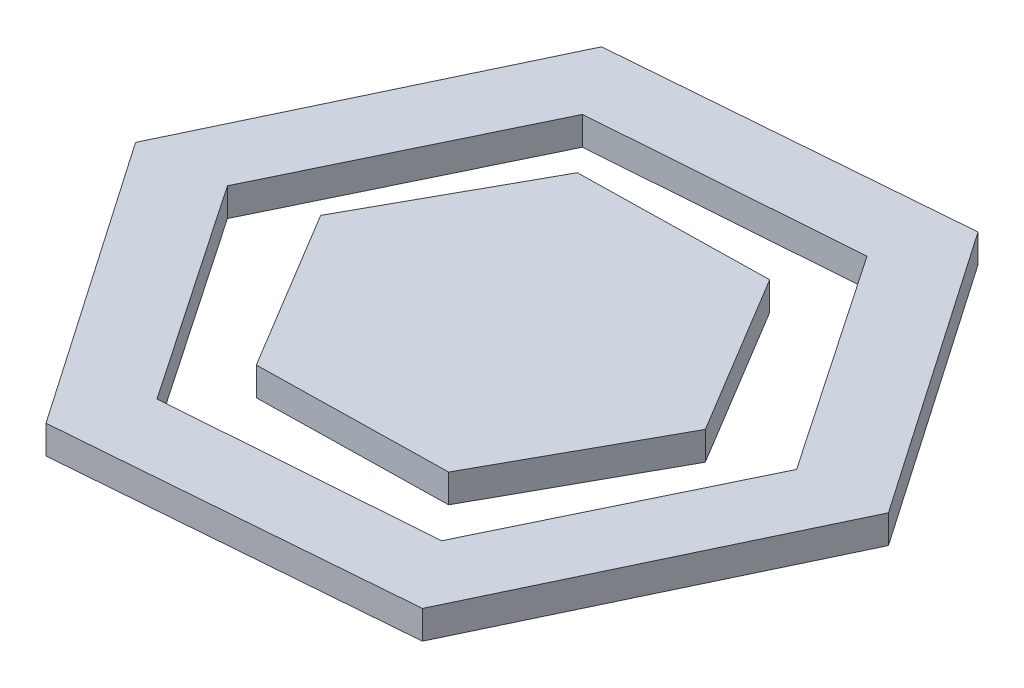
ISO-10303-21;
HEADER;
FILE_DESCRIPTION(('STEP AP214'),'2;1');
FILE_NAME('part.step','',(''),(''),'','','');
FILE_SCHEMA(('AUTOMOTIVE_DESIGN { 1 0 10303 214 1 1 1 1 }'));
ENDSEC;
DATA;
#1=APPLICATION_CONTEXT('core data for automotive mechanical design processes');
#2=APPLICATION_PROTOCOL_DEFINITION('international standard','automotive_design',2000,#1);
#3=PRODUCT_CONTEXT('',#1,'mechanical');
#4=PRODUCT('Part','Part','',(#3));
#5=PRODUCT_RELATED_PRODUCT_CATEGORY('part','',(#4));
#6=PRODUCT_DEFINITION_FORMATION('','',#4);
#7=PRODUCT_DEFINITION_CONTEXT('part definition',#1,'design');
#8=PRODUCT_DEFINITION('design','',#6,#7);
#9=PRODUCT_DEFINITION_SHAPE('','',#8);
#10=(LENGTH_UNIT() NAMED_UNIT(*) SI_UNIT(.MILLI.,.METRE.));
#11=(NAMED_UNIT(*) PLANE_ANGLE_UNIT() SI_UNIT($,.RADIAN.));
#12=(NAMED_UNIT(*) SI_UNIT($,.STERADIAN.) SOLID_ANGLE_UNIT());
#13=UNCERTAINTY_MEASURE_WITH_UNIT(LENGTH_MEASURE(1.E-05),#10,'distance_accuracy_value','');
#14=(GEOMETRIC_REPRESENTATION_CONTEXT(3) GLOBAL_UNCERTAINTY_ASSIGNED_CONTEXT((#13)) GLOBAL_UNIT_ASSIGNED_CONTEXT((#10,
#11,#12)) REPRESENTATION_CONTEXT('',''));
#15=CARTESIAN_POINT('',(0.,0.,0.));
#16=DIRECTION('',(0.,0.,1.));
#17=DIRECTION('',(1.,0.,0.));
#18=AXIS2_PLACEMENT_3D('',#15,#16,#17);
#19=CARTESIAN_POINT('',(-22.7227734733029,0.3,-21.5896592743475));
#20=DIRECTION('',(-0.018496490683271,0.,-0.999828925282922));
#21=DIRECTION('',(-0.999828925282923,0.,0.018496490683271));
#22=AXIS2_PLACEMENT_3D('',#19,#20,#21);
#23=PLANE('',#22);
#24=DIRECTION('',(0.999828925282922,0.,-0.018496490683271));
#25=VECTOR('',#24,1.);
#26=CARTESIAN_POINT('',(-22.7227734733029,0.,-21.5896592743475));
#27=LINE('',#26,#25);
#28=CARTESIAN_POINT('',(-22.7227734733029,0.,-21.5896592743475));
#29=VERTEX_POINT('',#28);
#30=CARTESIAN_POINT('',(-20.7281056601451,0.,-21.626559941741));
#31=VERTEX_POINT('',#30);
#32=EDGE_CURVE('E127',#29,#31,#27,.T.);
#33=ORIENTED_EDGE('',*,*,#32,.T.);
#34=DIRECTION('',(0.,-1.,0.));
#35=VECTOR('',#34,1.);
#36=CARTESIAN_POINT('',(-20.7281056601451,0.3,-21.626559941741));
#37=LINE('',#36,#35);
#38=CARTESIAN_POINT('',(-20.7281056601451,0.3,-21.626559941741));
#39=VERTEX_POINT('',#38);
#40=EDGE_CURVE('E12',#39,#31,#37,.T.);
#41=ORIENTED_EDGE('',*,*,#40,.F.);
#42=DIRECTION('',(0.999828925282922,0.,-0.018496490683271));
#43=VECTOR('',#42,1.);
#44=CARTESIAN_POINT('',(-22.7227734733029,0.3,-21.5896592743475));
#45=LINE('',#44,#43);
#46=CARTESIAN_POINT('',(-22.7227734733029,0.3,-21.5896592743475));
#47=VERTEX_POINT('',#46);
#48=EDGE_CURVE('E137',#47,#39,#45,.T.);
#49=ORIENTED_EDGE('',*,*,#48,.F.);
#50=DIRECTION('',(0.,-1.,0.));
#51=VECTOR('',#50,1.);
#52=CARTESIAN_POINT('',(-22.7227734733029,0.3,-21.5896592743475));
#53=LINE('',#52,#51);
#54=EDGE_CURVE('E123',#47,#29,#53,.T.);
#55=ORIENTED_EDGE('',*,*,#54,.T.);
#56=EDGE_LOOP('',(#33,#41,#49,#55));
#57=FACE_BOUND('',#56,.T.);
#58=ADVANCED_FACE('F43',(#57),#23,.F.);
#59=CARTESIAN_POINT('',(-20.7281056601451,0.3,-21.626559941741));
#60=DIRECTION('',(-0.87512549407514,0.,-0.483896031828886));
#61=DIRECTION('',(-0.483896031828886,0.,0.87512549407514));
#62=AXIS2_PLACEMENT_3D('',#59,#60,#61);
#63=PLANE('',#62);
#64=DIRECTION('',(0.483896031828886,0.,-0.87512549407514));
#65=VECTOR('',#64,1.);
#66=CARTESIAN_POINT('',(-20.7281056601451,0.,-21.626559941741));
#67=LINE('',#66,#65);
#68=CARTESIAN_POINT('',(-19.7627286689455,0.,-23.3724432737436));
#69=VERTEX_POINT('',#68);
#70=EDGE_CURVE('E130',#31,#69,#67,.T.);
#71=ORIENTED_EDGE('',*,*,#70,.T.);
#72=DIRECTION('',(0.,-1.,0.));
#73=VECTOR('',#72,1.);
#74=CARTESIAN_POINT('',(-19.7627286689455,0.3,-23.3724432737436));
#75=LINE('',#74,#73);
#76=CARTESIAN_POINT('',(-19.7627286689455,0.3,-23.3724432737436));
#77=VERTEX_POINT('',#76);
#78=EDGE_CURVE('E51',#77,#69,#75,.T.);
#79=ORIENTED_EDGE('',*,*,#78,.F.);
#80=DIRECTION('',(0.483896031828886,0.,-0.87512549407514));
#81=VECTOR('',#80,1.);
#82=CARTESIAN_POINT('',(-20.7281056601451,0.3,-21.626559941741));
#83=LINE('',#82,#81);
#84=EDGE_CURVE('E96',#39,#77,#83,.T.);
#85=ORIENTED_EDGE('',*,*,#84,.F.);
#86=ORIENTED_EDGE('',*,*,#40,.T.);
#87=EDGE_LOOP('',(#71,#79,#85,#86));
#88=FACE_BOUND('',#87,.T.);
#89=ADVANCED_FACE('F161',(#88),#63,.F.);
#90=CARTESIAN_POINT('',(-19.7627286689455,0.3,-23.3724432737436));
#91=DIRECTION('',(-0.856629003391868,0.,0.515932893454037));
#92=DIRECTION('',(0.515932893454037,0.,0.856629003391868));
#93=AXIS2_PLACEMENT_3D('',#90,#91,#92);
#94=PLANE('',#93);
#95=DIRECTION('',(-0.515932893454037,0.,-0.856629003391868));
#96=VECTOR('',#95,1.);
#97=CARTESIAN_POINT('',(-19.7627286689455,0.,-23.3724432737436));
#98=LINE('',#97,#96);
#99=CARTESIAN_POINT('',(-20.7920194909039,0.,-25.0814259383527));
#100=VERTEX_POINT('',#99);
#101=EDGE_CURVE('E132',#69,#100,#98,.T.);
#102=ORIENTED_EDGE('',*,*,#101,.T.);
#103=DIRECTION('',(0.,-1.,0.));
#104=VECTOR('',#103,1.);
#105=CARTESIAN_POINT('',(-20.7920194909039,0.3,-25.0814259383527));
#106=LINE('',#105,#104);
#107=CARTESIAN_POINT('',(-20.7920194909039,0.3,-25.0814259383527));
#108=VERTEX_POINT('',#107);
#109=EDGE_CURVE('E118',#108,#100,#106,.T.);
#110=ORIENTED_EDGE('',*,*,#109,.F.);
#111=DIRECTION('',(-0.515932893454037,0.,-0.856629003391868));
#112=VECTOR('',#111,1.);
#113=CARTESIAN_POINT('',(-19.7627286689455,0.3,-23.3724432737436));
#114=LINE('',#113,#112);
#115=EDGE_CURVE('E109',#77,#108,#114,.T.);
#116=ORIENTED_EDGE('',*,*,#115,.F.);
#117=ORIENTED_EDGE('',*,*,#78,.T.);
#118=EDGE_LOOP('',(#102,#110,#116,#117));
#119=FACE_BOUND('',#118,.T.);
#120=ADVANCED_FACE('F143',(#119),#94,.F.);
#121=CARTESIAN_POINT('',(-20.7920194909039,0.3,-25.0814259383527));
#122=DIRECTION('',(0.018496490683271,0.,0.999828925282922));
#123=DIRECTION('',(0.999828925282923,0.,-0.018496490683271));
#124=AXIS2_PLACEMENT_3D('',#121,#122,#123);
#125=PLANE('',#124);
#126=DIRECTION('',(-0.999828925282922,0.,0.018496490683271));
#127=VECTOR('',#126,1.);
#128=CARTESIAN_POINT('',(-20.7920194909039,0.,-25.0814259383527));
#129=LINE('',#128,#127);
#130=CARTESIAN_POINT('',(-22.7866873040617,0.,-25.0445252709592));
#131=VERTEX_POINT('',#130);
#132=EDGE_CURVE('E117',#100,#131,#129,.T.);
#133=ORIENTED_EDGE('',*,*,#132,.T.);
#134=DIRECTION('',(0.,-1.,0.));
#135=VECTOR('',#134,1.);
#136=CARTESIAN_POINT('',(-22.7866873040617,0.3,-25.0445252709592));
#137=LINE('',#136,#135);
#138=CARTESIAN_POINT('',(-22.7866873040617,0.3,-25.0445252709592));
#139=VERTEX_POINT('',#138);
#140=EDGE_CURVE('E114',#139,#131,#137,.T.);
#141=ORIENTED_EDGE('',*,*,#140,.F.);
#142=DIRECTION('',(-0.999828925282922,0.,0.018496490683271));
#143=VECTOR('',#142,1.);
#144=CARTESIAN_POINT('',(-20.7920194909039,0.3,-25.0814259383527));
#145=LINE('',#144,#143);
#146=EDGE_CURVE('E103',#108,#139,#145,.T.);
#147=ORIENTED_EDGE('',*,*,#146,.F.);
#148=ORIENTED_EDGE('',*,*,#109,.T.);
#149=EDGE_LOOP('',(#133,#141,#147,#148));
#150=FACE_BOUND('',#149,.T.);
#151=ADVANCED_FACE('F115',(#150),#125,.F.);
#152=CARTESIAN_POINT('',(-22.7866873040617,0.3,-25.0445252709592));
#153=DIRECTION('',(0.87512549407514,0.,0.483896031828885));
#154=DIRECTION('',(0.483896031828885,0.,-0.87512549407514));
#155=AXIS2_PLACEMENT_3D('',#152,#153,#154);
#156=PLANE('',#155);
#157=DIRECTION('',(-0.483896031828885,0.,0.875125494075141));
#158=VECTOR('',#157,1.);
#159=CARTESIAN_POINT('',(-22.7866873040617,0.,-25.0445252709592));
#160=LINE('',#159,#158);
#161=CARTESIAN_POINT('',(-23.7520642952612,0.,-23.2986419389566));
#162=VERTEX_POINT('',#161);
#163=EDGE_CURVE('E82',#131,#162,#160,.T.);
#164=ORIENTED_EDGE('',*,*,#163,.T.);
#165=DIRECTION('',(0.,-1.,0.));
#166=VECTOR('',#165,1.);
#167=CARTESIAN_POINT('',(-23.7520642952612,0.3,-23.2986419389566));
#168=LINE('',#167,#166);
#169=CARTESIAN_POINT('',(-23.7520642952612,0.3,-23.2986419389566));
#170=VERTEX_POINT('',#169);
#171=EDGE_CURVE('E119',#170,#162,#168,.T.);
#172=ORIENTED_EDGE('',*,*,#171,.F.);
#173=DIRECTION('',(-0.483896031828885,0.,0.875125494075141));
#174=VECTOR('',#173,1.);
#175=CARTESIAN_POINT('',(-22.7866873040617,0.3,-25.0445252709592));
#176=LINE('',#175,#174);
#177=EDGE_CURVE('E107',#139,#170,#176,.T.);
#178=ORIENTED_EDGE('',*,*,#177,.F.);
#179=ORIENTED_EDGE('',*,*,#140,.T.);
#180=EDGE_LOOP('',(#164,#172,#178,#179));
#181=FACE_BOUND('',#180,.T.);
#182=ADVANCED_FACE('F121',(#181),#156,.F.);
#183=CARTESIAN_POINT('',(-23.7520642952612,0.3,-23.2986419389566));
#184=DIRECTION('',(0.856629003391869,0.,-0.515932893454036));
#185=DIRECTION('',(-0.515932893454036,0.,-0.856629003391869));
#186=AXIS2_PLACEMENT_3D('',#183,#184,#185);
#187=PLANE('',#186);
#188=DIRECTION('',(0.515932893454036,0.,0.856629003391869));
#189=VECTOR('',#188,1.);
#190=CARTESIAN_POINT('',(-23.7520642952612,0.,-23.2986419389566));
#191=LINE('',#190,#189);
#192=EDGE_CURVE('E88',#162,#29,#191,.T.);
#193=ORIENTED_EDGE('',*,*,#192,.T.);
#194=ORIENTED_EDGE('',*,*,#54,.F.);
#195=DIRECTION('',(0.515932893454036,0.,0.856629003391869));
#196=VECTOR('',#195,1.);
#197=CARTESIAN_POINT('',(-23.7520642952612,0.3,-23.2986419389566));
#198=LINE('',#197,#196);
#199=EDGE_CURVE('E59',#170,#47,#198,.T.);
#200=ORIENTED_EDGE('',*,*,#199,.F.);
#201=ORIENTED_EDGE('',*,*,#171,.T.);
#202=EDGE_LOOP('',(#193,#194,#200,#201));
#203=FACE_BOUND('',#202,.T.);
#204=ADVANCED_FACE('F150',(#203),#187,.F.);
#205=CARTESIAN_POINT('',(0.,0.3,0.));
#206=DIRECTION('',(0.,1.,0.));
#207=DIRECTION('',(0.,0.,1.));
#208=AXIS2_PLACEMENT_3D('',#205,#206,#207);
#209=PLANE('',#208);
#210=ORIENTED_EDGE('',*,*,#48,.T.);
#211=ORIENTED_EDGE('',*,*,#84,.T.);
#212=ORIENTED_EDGE('',*,*,#115,.T.);
#213=ORIENTED_EDGE('',*,*,#146,.T.);
#214=ORIENTED_EDGE('',*,*,#177,.T.);
#215=ORIENTED_EDGE('',*,*,#199,.T.);
#216=EDGE_LOOP('',(#210,#211,#212,#213,#214,#215));
#217=FACE_BOUND('',#216,.T.);
#218=ADVANCED_FACE('F105',(#217),#209,.T.);
#219=CARTESIAN_POINT('',(0.,0.,0.));
#220=DIRECTION('',(0.,1.,0.));
#221=DIRECTION('',(0.,0.,1.));
#222=AXIS2_PLACEMENT_3D('',#219,#220,#221);
#223=PLANE('',#222);
#224=ORIENTED_EDGE('',*,*,#32,.F.);
#225=ORIENTED_EDGE('',*,*,#192,.F.);
#226=ORIENTED_EDGE('',*,*,#163,.F.);
#227=ORIENTED_EDGE('',*,*,#132,.F.);
#228=ORIENTED_EDGE('',*,*,#101,.F.);
#229=ORIENTED_EDGE('',*,*,#70,.F.);
#230=EDGE_LOOP('',(#224,#225,#226,#227,#228,#229));
#231=FACE_BOUND('',#230,.T.);
#232=ADVANCED_FACE('F146',(#231),#223,.F.);
#233=CLOSED_SHELL('',(#58,#89,#120,#151,#182,#204,#218,#232));
#234=MANIFOLD_SOLID_BREP('B2',#233);
#235=CARTESIAN_POINT('',(0.,0.3,0.));
#236=DIRECTION('',(0.,1.,0.));
#237=DIRECTION('',(0.,0.,1.));
#238=AXIS2_PLACEMENT_3D('',#235,#236,#237);
#239=PLANE('',#238);
#240=DIRECTION('',(0.996823738084933,0.,-0.0796394072704047));
#241=VECTOR('',#240,1.);
#242=CARTESIAN_POINT('',(-23.3011035479228,0.3,-19.9465054507831));
#243=LINE('',#242,#241);
#244=CARTESIAN_POINT('',(-23.3011035479228,0.3,-19.9465054507831));
#245=VERTEX_POINT('',#244);
#246=CARTESIAN_POINT('',(-19.6189570412195,0.3,-20.2406838035579));
#247=VERTEX_POINT('',#246);
#248=EDGE_CURVE('E359',#245,#247,#243,.T.);
#249=ORIENTED_EDGE('',*,*,#248,.T.);
#250=DIRECTION('',(0.429442119203962,0.,-0.903094383912119));
#251=VECTOR('',#250,1.);
#252=CARTESIAN_POINT('',(-19.6189570412195,0.3,-20.2406838035579));
#253=LINE('',#252,#251);
#254=CARTESIAN_POINT('',(-18.0326497146143,0.3,-23.5766053952065));
#255=VERTEX_POINT('',#254);
#256=EDGE_CURVE('E362',#247,#255,#253,.T.);
#257=ORIENTED_EDGE('',*,*,#256,.T.);
#258=DIRECTION('',(-0.567381618880972,0.,-0.823454976641715));
#259=VECTOR('',#258,1.);
#260=CARTESIAN_POINT('',(-18.0326497146143,0.3,-23.5766053952065));
#261=LINE('',#260,#259);
#262=CARTESIAN_POINT('',(-20.1284888947124,0.3,-26.6183486340802));
#263=VERTEX_POINT('',#262);
#264=EDGE_CURVE('E365',#255,#263,#261,.T.);
#265=ORIENTED_EDGE('',*,*,#264,.T.);
#266=DIRECTION('',(-0.996823738084933,0.,0.0796394072704037));
#267=VECTOR('',#266,1.);
#268=CARTESIAN_POINT('',(-20.1284888947124,0.3,-26.6183486340802));
#269=LINE('',#268,#267);
#270=CARTESIAN_POINT('',(-23.8106354014156,0.3,-26.3241702813054));
#271=VERTEX_POINT('',#270);
#272=EDGE_CURVE('E367',#263,#271,#269,.T.);
#273=ORIENTED_EDGE('',*,*,#272,.T.);
#274=DIRECTION('',(-0.429442119203962,0.,0.903094383912119));
#275=VECTOR('',#274,1.);
#276=CARTESIAN_POINT('',(-23.8106354014156,0.3,-26.3241702813054));
#277=LINE('',#276,#275);
#278=CARTESIAN_POINT('',(-25.3969427280208,0.3,-22.9882486896569));
#279=VERTEX_POINT('',#278);
#280=EDGE_CURVE('E369',#271,#279,#277,.T.);
#281=ORIENTED_EDGE('',*,*,#280,.T.);
#282=DIRECTION('',(0.567381618880971,0.,0.823454976641715));
#283=VECTOR('',#282,1.);
#284=CARTESIAN_POINT('',(-25.3969427280208,0.3,-22.9882486896569));
#285=LINE('',#284,#283);
#286=EDGE_CURVE('E371',#279,#245,#285,.T.);
#287=ORIENTED_EDGE('',*,*,#286,.T.);
#288=EDGE_LOOP('',(#249,#257,#265,#273,#281,#287));
#289=FACE_BOUND('',#288,.T.);
#290=DIRECTION('',(0.435156540688244,0.,-0.900354810669794));
#291=VECTOR('',#290,1.);
#292=CARTESIAN_POINT('',(-20.1364291043533,0.3,-20.9603440210333));
#293=LINE('',#292,#291);
#294=CARTESIAN_POINT('',(-20.1364291043533,0.3,-20.9603440210333));
#295=VERTEX_POINT('',#294);
#296=CARTESIAN_POINT('',(-18.9146297766079,0.3,-23.4882915515216));
#297=VERTEX_POINT('',#296);
#298=EDGE_CURVE('E316',#295,#297,#293,.T.);
#299=ORIENTED_EDGE('',*,*,#298,.F.);
#300=DIRECTION('',(0.997308408803692,0.,-0.07332078647592));
#301=VECTOR('',#300,1.);
#302=CARTESIAN_POINT('',(-22.9365955490629,0.3,-20.7544795119434));
#303=LINE('',#302,#301);
#304=CARTESIAN_POINT('',(-22.9365955490629,0.3,-20.7544795119434));
#305=VERTEX_POINT('',#304);
#306=EDGE_CURVE('E308',#305,#295,#303,.T.);
#307=ORIENTED_EDGE('',*,*,#306,.F.);
#308=DIRECTION('',(0.562151868115448,0.,0.827034024193873));
#309=VECTOR('',#308,1.);
#310=CARTESIAN_POINT('',(-24.5149626660272,0.3,-23.0765625333418));
#311=LINE('',#310,#309);
#312=CARTESIAN_POINT('',(-24.5149626660272,0.3,-23.0765625333418));
#313=VERTEX_POINT('',#312);
#314=EDGE_CURVE('E337',#313,#305,#311,.T.);
#315=ORIENTED_EDGE('',*,*,#314,.F.);
#316=DIRECTION('',(-0.435156540688244,0.,0.900354810669794));
#317=VECTOR('',#316,1.);
#318=CARTESIAN_POINT('',(-23.2931633382818,0.3,-25.6045100638301));
#319=LINE('',#318,#317);
#320=CARTESIAN_POINT('',(-23.2931633382818,0.3,-25.6045100638301));
#321=VERTEX_POINT('',#320);
#322=EDGE_CURVE('E335',#321,#313,#319,.T.);
#323=ORIENTED_EDGE('',*,*,#322,.F.);
#324=DIRECTION('',(-0.997308408803692,0.,0.0733207864759199));
#325=VECTOR('',#324,1.);
#326=CARTESIAN_POINT('',(-20.4929968935722,0.3,-25.8103745729199));
#327=LINE('',#326,#325);
#328=CARTESIAN_POINT('',(-20.4929968935722,0.3,-25.8103745729199));
#329=VERTEX_POINT('',#328);
#330=EDGE_CURVE('E331',#329,#321,#327,.T.);
#331=ORIENTED_EDGE('',*,*,#330,.F.);
#332=DIRECTION('',(-0.562151868115447,0.,-0.827034024193874));
#333=VECTOR('',#332,1.);
#334=CARTESIAN_POINT('',(-18.9146297766079,0.3,-23.4882915515216));
#335=LINE('',#334,#333);
#336=EDGE_CURVE('E329',#297,#329,#335,.T.);
#337=ORIENTED_EDGE('',*,*,#336,.F.);
#338=EDGE_LOOP('',(#299,#307,#315,#323,#331,#337));
#339=FACE_BOUND('',#338,.T.);
#340=ADVANCED_FACE('F219',(#289,#339),#239,.T.);
#341=CARTESIAN_POINT('',(0.,0.,0.));
#342=DIRECTION('',(0.,1.,0.));
#343=DIRECTION('',(0.,0.,1.));
#344=AXIS2_PLACEMENT_3D('',#341,#342,#343);
#345=PLANE('',#344);
#346=DIRECTION('',(0.996823738084933,0.,-0.0796394072704047));
#347=VECTOR('',#346,1.);
#348=CARTESIAN_POINT('',(-23.3011035479228,0.,-19.9465054507831));
#349=LINE('',#348,#347);
#350=CARTESIAN_POINT('',(-23.3011035479228,0.,-19.9465054507831));
#351=VERTEX_POINT('',#350);
#352=CARTESIAN_POINT('',(-19.6189570412195,0.,-20.2406838035579));
#353=VERTEX_POINT('',#352);
#354=EDGE_CURVE('E324',#351,#353,#349,.T.);
#355=ORIENTED_EDGE('',*,*,#354,.F.);
#356=DIRECTION('',(0.567381618880971,0.,0.823454976641715));
#357=VECTOR('',#356,1.);
#358=CARTESIAN_POINT('',(-25.3969427280208,0.,-22.9882486896569));
#359=LINE('',#358,#357);
#360=CARTESIAN_POINT('',(-25.3969427280208,0.,-22.9882486896569));
#361=VERTEX_POINT('',#360);
#362=EDGE_CURVE('E363',#361,#351,#359,.T.);
#363=ORIENTED_EDGE('',*,*,#362,.F.);
#364=DIRECTION('',(-0.429442119203962,0.,0.903094383912119));
#365=VECTOR('',#364,1.);
#366=CARTESIAN_POINT('',(-23.8106354014156,0.,-26.3241702813054));
#367=LINE('',#366,#365);
#368=CARTESIAN_POINT('',(-23.8106354014156,0.,-26.3241702813054));
#369=VERTEX_POINT('',#368);
#370=EDGE_CURVE('E382',#369,#361,#367,.T.);
#371=ORIENTED_EDGE('',*,*,#370,.F.);
#372=DIRECTION('',(-0.996823738084933,0.,0.0796394072704037));
#373=VECTOR('',#372,1.);
#374=CARTESIAN_POINT('',(-20.1284888947124,0.,-26.6183486340802));
#375=LINE('',#374,#373);
#376=CARTESIAN_POINT('',(-20.1284888947124,0.,-26.6183486340802));
#377=VERTEX_POINT('',#376);
#378=EDGE_CURVE('E380',#377,#369,#375,.T.);
#379=ORIENTED_EDGE('',*,*,#378,.F.);
#380=DIRECTION('',(-0.567381618880972,0.,-0.823454976641715));
#381=VECTOR('',#380,1.);
#382=CARTESIAN_POINT('',(-18.0326497146143,0.,-23.5766053952065));
#383=LINE('',#382,#381);
#384=CARTESIAN_POINT('',(-18.0326497146143,0.,-23.5766053952065));
#385=VERTEX_POINT('',#384);
#386=EDGE_CURVE('E378',#385,#377,#383,.T.);
#387=ORIENTED_EDGE('',*,*,#386,.F.);
#388=DIRECTION('',(0.429442119203962,0.,-0.903094383912119));
#389=VECTOR('',#388,1.);
#390=CARTESIAN_POINT('',(-19.6189570412195,0.,-20.2406838035579));
#391=LINE('',#390,#389);
#392=EDGE_CURVE('E376',#353,#385,#391,.T.);
#393=ORIENTED_EDGE('',*,*,#392,.F.);
#394=EDGE_LOOP('',(#355,#363,#371,#379,#387,#393));
#395=FACE_BOUND('',#394,.T.);
#396=DIRECTION('',(0.997308408803692,0.,-0.07332078647592));
#397=VECTOR('',#396,1.);
#398=CARTESIAN_POINT('',(-22.9365955490629,0.,-20.7544795119434));
#399=LINE('',#398,#397);
#400=CARTESIAN_POINT('',(-22.9365955490629,0.,-20.7544795119434));
#401=VERTEX_POINT('',#400);
#402=CARTESIAN_POINT('',(-20.1364291043533,0.,-20.9603440210333));
#403=VERTEX_POINT('',#402);
#404=EDGE_CURVE('E242',#401,#403,#399,.T.);
#405=ORIENTED_EDGE('',*,*,#404,.T.);
#406=DIRECTION('',(0.435156540688244,0.,-0.900354810669794));
#407=VECTOR('',#406,1.);
#408=CARTESIAN_POINT('',(-20.1364291043533,0.,-20.9603440210333));
#409=LINE('',#408,#407);
#410=CARTESIAN_POINT('',(-18.9146297766079,0.,-23.4882915515216));
#411=VERTEX_POINT('',#410);
#412=EDGE_CURVE('E323',#403,#411,#409,.T.);
#413=ORIENTED_EDGE('',*,*,#412,.T.);
#414=DIRECTION('',(-0.562151868115447,0.,-0.827034024193874));
#415=VECTOR('',#414,1.);
#416=CARTESIAN_POINT('',(-18.9146297766079,0.,-23.4882915515216));
#417=LINE('',#416,#415);
#418=CARTESIAN_POINT('',(-20.4929968935722,0.,-25.8103745729199));
#419=VERTEX_POINT('',#418);
#420=EDGE_CURVE('E341',#411,#419,#417,.T.);
#421=ORIENTED_EDGE('',*,*,#420,.T.);
#422=DIRECTION('',(-0.997308408803692,0.,0.0733207864759199));
#423=VECTOR('',#422,1.);
#424=CARTESIAN_POINT('',(-20.4929968935722,0.,-25.8103745729199));
#425=LINE('',#424,#423);
#426=CARTESIAN_POINT('',(-23.2931633382818,0.,-25.6045100638301));
#427=VERTEX_POINT('',#426);
#428=EDGE_CURVE('E344',#419,#427,#425,.T.);
#429=ORIENTED_EDGE('',*,*,#428,.T.);
#430=DIRECTION('',(-0.435156540688244,0.,0.900354810669794));
#431=VECTOR('',#430,1.);
#432=CARTESIAN_POINT('',(-23.2931633382818,0.,-25.6045100638301));
#433=LINE('',#432,#431);
#434=CARTESIAN_POINT('',(-24.5149626660272,0.,-23.0765625333418));
#435=VERTEX_POINT('',#434);
#436=EDGE_CURVE('E347',#427,#435,#433,.T.);
#437=ORIENTED_EDGE('',*,*,#436,.T.);
#438=DIRECTION('',(0.562151868115448,0.,0.827034024193873));
#439=VECTOR('',#438,1.);
#440=CARTESIAN_POINT('',(-24.5149626660272,0.,-23.0765625333418));
#441=LINE('',#440,#439);
#442=EDGE_CURVE('E317',#435,#401,#441,.T.);
#443=ORIENTED_EDGE('',*,*,#442,.T.);
#444=EDGE_LOOP('',(#405,#413,#421,#429,#437,#443));
#445=FACE_BOUND('',#444,.T.);
#446=ADVANCED_FACE('F406',(#395,#445),#345,.F.);
#447=CARTESIAN_POINT('',(-23.3011035479228,0.3,-19.9465054507831));
#448=DIRECTION('',(-0.0796394072704047,0.,-0.996823738084933));
#449=DIRECTION('',(-0.996823738084933,0.,0.0796394072704047));
#450=AXIS2_PLACEMENT_3D('',#447,#448,#449);
#451=PLANE('',#450);
#452=ORIENTED_EDGE('',*,*,#354,.T.);
#453=DIRECTION('',(0.,-1.,0.));
#454=VECTOR('',#453,1.);
#455=CARTESIAN_POINT('',(-19.6189570412195,0.3,-20.2406838035579));
#456=LINE('',#455,#454);
#457=EDGE_CURVE('E41',#247,#353,#456,.T.);
#458=ORIENTED_EDGE('',*,*,#457,.F.);
#459=ORIENTED_EDGE('',*,*,#248,.F.);
#460=DIRECTION('',(0.,-1.,0.));
#461=VECTOR('',#460,1.);
#462=CARTESIAN_POINT('',(-23.3011035479228,0.3,-19.9465054507831));
#463=LINE('',#462,#461);
#464=EDGE_CURVE('E373',#245,#351,#463,.T.);
#465=ORIENTED_EDGE('',*,*,#464,.T.);
#466=EDGE_LOOP('',(#452,#458,#459,#465));
#467=FACE_BOUND('',#466,.T.);
#468=ADVANCED_FACE('F221',(#467),#451,.F.);
#469=CARTESIAN_POINT('',(-19.6189570412195,0.3,-20.2406838035579));
#470=DIRECTION('',(-0.903094383912119,0.,-0.429442119203962));
#471=DIRECTION('',(-0.429442119203962,0.,0.903094383912119));
#472=AXIS2_PLACEMENT_3D('',#469,#470,#471);
#473=PLANE('',#472);
#474=ORIENTED_EDGE('',*,*,#392,.T.);
#475=DIRECTION('',(0.,-1.,0.));
#476=VECTOR('',#475,1.);
#477=CARTESIAN_POINT('',(-18.0326497146143,0.3,-23.5766053952065));
#478=LINE('',#477,#476);
#479=EDGE_CURVE('E227',#255,#385,#478,.T.);
#480=ORIENTED_EDGE('',*,*,#479,.F.);
#481=ORIENTED_EDGE('',*,*,#256,.F.);
#482=ORIENTED_EDGE('',*,*,#457,.T.);
#483=EDGE_LOOP('',(#474,#480,#481,#482));
#484=FACE_BOUND('',#483,.T.);
#485=ADVANCED_FACE('F423',(#484),#473,.F.);
#486=CARTESIAN_POINT('',(-18.0326497146143,0.3,-23.5766053952065));
#487=DIRECTION('',(-0.823454976641715,0.,0.567381618880972));
#488=DIRECTION('',(0.567381618880972,0.,0.823454976641715));
#489=AXIS2_PLACEMENT_3D('',#486,#487,#488);
#490=PLANE('',#489);
#491=ORIENTED_EDGE('',*,*,#386,.T.);
#492=DIRECTION('',(0.,-1.,0.));
#493=VECTOR('',#492,1.);
#494=CARTESIAN_POINT('',(-20.1284888947124,0.3,-26.6183486340802));
#495=LINE('',#494,#493);
#496=EDGE_CURVE('E393',#263,#377,#495,.T.);
#497=ORIENTED_EDGE('',*,*,#496,.F.);
#498=ORIENTED_EDGE('',*,*,#264,.F.);
#499=ORIENTED_EDGE('',*,*,#479,.T.);
#500=EDGE_LOOP('',(#491,#497,#498,#499));
#501=FACE_BOUND('',#500,.T.);
#502=ADVANCED_FACE('F400',(#501),#490,.F.);
#503=CARTESIAN_POINT('',(-20.1284888947124,0.3,-26.6183486340802));
#504=DIRECTION('',(0.0796394072704037,0.,0.996823738084933));
#505=DIRECTION('',(0.996823738084933,0.,-0.0796394072704037));
#506=AXIS2_PLACEMENT_3D('',#503,#504,#505);
#507=PLANE('',#506);
#508=ORIENTED_EDGE('',*,*,#378,.T.);
#509=DIRECTION('',(0.,-1.,0.));
#510=VECTOR('',#509,1.);
#511=CARTESIAN_POINT('',(-23.8106354014156,0.3,-26.3241702813054));
#512=LINE('',#511,#510);
#513=EDGE_CURVE('E390',#271,#369,#512,.T.);
#514=ORIENTED_EDGE('',*,*,#513,.F.);
#515=ORIENTED_EDGE('',*,*,#272,.F.);
#516=ORIENTED_EDGE('',*,*,#496,.T.);
#517=EDGE_LOOP('',(#508,#514,#515,#516));
#518=FACE_BOUND('',#517,.T.);
#519=ADVANCED_FACE('F412',(#518),#507,.F.);
#520=CARTESIAN_POINT('',(-23.8106354014156,0.3,-26.3241702813054));
#521=DIRECTION('',(0.903094383912119,0.,0.429442119203962));
#522=DIRECTION('',(0.429442119203962,0.,-0.903094383912119));
#523=AXIS2_PLACEMENT_3D('',#520,#521,#522);
#524=PLANE('',#523);
#525=ORIENTED_EDGE('',*,*,#370,.T.);
#526=DIRECTION('',(0.,-1.,0.));
#527=VECTOR('',#526,1.);
#528=CARTESIAN_POINT('',(-25.3969427280208,0.3,-22.9882486896569));
#529=LINE('',#528,#527);
#530=EDGE_CURVE('E387',#279,#361,#529,.T.);
#531=ORIENTED_EDGE('',*,*,#530,.F.);
#532=ORIENTED_EDGE('',*,*,#280,.F.);
#533=ORIENTED_EDGE('',*,*,#513,.T.);
#534=EDGE_LOOP('',(#525,#531,#532,#533));
#535=FACE_BOUND('',#534,.T.);
#536=ADVANCED_FACE('F416',(#535),#524,.F.);
#537=CARTESIAN_POINT('',(-25.3969427280208,0.3,-22.9882486896569));
#538=DIRECTION('',(0.823454976641715,0.,-0.567381618880971));
#539=DIRECTION('',(-0.567381618880971,0.,-0.823454976641715));
#540=AXIS2_PLACEMENT_3D('',#537,#538,#539);
#541=PLANE('',#540);
#542=ORIENTED_EDGE('',*,*,#362,.T.);
#543=ORIENTED_EDGE('',*,*,#464,.F.);
#544=ORIENTED_EDGE('',*,*,#286,.F.);
#545=ORIENTED_EDGE('',*,*,#530,.T.);
#546=EDGE_LOOP('',(#542,#543,#544,#545));
#547=FACE_BOUND('',#546,.T.);
#548=ADVANCED_FACE('F426',(#547),#541,.F.);
#549=CARTESIAN_POINT('',(-22.9365955490629,0.3,-20.7544795119434));
#550=DIRECTION('',(-0.07332078647592,0.,-0.997308408803692));
#551=DIRECTION('',(-0.997308408803692,0.,0.07332078647592));
#552=AXIS2_PLACEMENT_3D('',#549,#550,#551);
#553=PLANE('',#552);
#554=ORIENTED_EDGE('',*,*,#404,.F.);
#555=DIRECTION('',(0.,-1.,0.));
#556=VECTOR('',#555,1.);
#557=CARTESIAN_POINT('',(-22.9365955490629,0.3,-20.7544795119434));
#558=LINE('',#557,#556);
#559=EDGE_CURVE('E312',#305,#401,#558,.T.);
#560=ORIENTED_EDGE('',*,*,#559,.F.);
#561=ORIENTED_EDGE('',*,*,#306,.T.);
#562=DIRECTION('',(0.,-1.,0.));
#563=VECTOR('',#562,1.);
#564=CARTESIAN_POINT('',(-20.1364291043533,0.3,-20.9603440210333));
#565=LINE('',#564,#563);
#566=EDGE_CURVE('E311',#295,#403,#565,.T.);
#567=ORIENTED_EDGE('',*,*,#566,.T.);
#568=EDGE_LOOP('',(#554,#560,#561,#567));
#569=FACE_BOUND('',#568,.T.);
#570=ADVANCED_FACE('F310',(#569),#553,.T.);
#571=CARTESIAN_POINT('',(-20.1364291043533,0.3,-20.9603440210333));
#572=DIRECTION('',(-0.900354810669794,0.,-0.435156540688244));
#573=DIRECTION('',(-0.435156540688244,0.,0.900354810669794));
#574=AXIS2_PLACEMENT_3D('',#571,#572,#573);
#575=PLANE('',#574);
#576=ORIENTED_EDGE('',*,*,#412,.F.);
#577=ORIENTED_EDGE('',*,*,#566,.F.);
#578=ORIENTED_EDGE('',*,*,#298,.T.);
#579=DIRECTION('',(0.,-1.,0.));
#580=VECTOR('',#579,1.);
#581=CARTESIAN_POINT('',(-18.9146297766079,0.3,-23.4882915515216));
#582=LINE('',#581,#580);
#583=EDGE_CURVE('E325',#297,#411,#582,.T.);
#584=ORIENTED_EDGE('',*,*,#583,.T.);
#585=EDGE_LOOP('',(#576,#577,#578,#584));
#586=FACE_BOUND('',#585,.T.);
#587=ADVANCED_FACE('F320',(#586),#575,.T.);
#588=CARTESIAN_POINT('',(-18.9146297766079,0.3,-23.4882915515216));
#589=DIRECTION('',(-0.827034024193874,0.,0.562151868115447));
#590=DIRECTION('',(0.562151868115447,0.,0.827034024193874));
#591=AXIS2_PLACEMENT_3D('',#588,#589,#590);
#592=PLANE('',#591);
#593=ORIENTED_EDGE('',*,*,#420,.F.);
#594=ORIENTED_EDGE('',*,*,#583,.F.);
#595=ORIENTED_EDGE('',*,*,#336,.T.);
#596=DIRECTION('',(0.,-1.,0.));
#597=VECTOR('',#596,1.);
#598=CARTESIAN_POINT('',(-20.4929968935722,0.3,-25.8103745729199));
#599=LINE('',#598,#597);
#600=EDGE_CURVE('E356',#329,#419,#599,.T.);
#601=ORIENTED_EDGE('',*,*,#600,.T.);
#602=EDGE_LOOP('',(#593,#594,#595,#601));
#603=FACE_BOUND('',#602,.T.);
#604=ADVANCED_FACE('F444',(#603),#592,.T.);
#605=CARTESIAN_POINT('',(-20.4929968935722,0.3,-25.8103745729199));
#606=DIRECTION('',(0.0733207864759199,0.,0.997308408803692));
#607=DIRECTION('',(0.997308408803692,0.,-0.0733207864759199));
#608=AXIS2_PLACEMENT_3D('',#605,#606,#607);
#609=PLANE('',#608);
#610=ORIENTED_EDGE('',*,*,#428,.F.);
#611=ORIENTED_EDGE('',*,*,#600,.F.);
#612=ORIENTED_EDGE('',*,*,#330,.T.);
#613=DIRECTION('',(0.,-1.,0.));
#614=VECTOR('',#613,1.);
#615=CARTESIAN_POINT('',(-23.2931633382818,0.3,-25.6045100638301));
#616=LINE('',#615,#614);
#617=EDGE_CURVE('E354',#321,#427,#616,.T.);
#618=ORIENTED_EDGE('',*,*,#617,.T.);
#619=EDGE_LOOP('',(#610,#611,#612,#618));
#620=FACE_BOUND('',#619,.T.);
#621=ADVANCED_FACE('F447',(#620),#609,.T.);
#622=CARTESIAN_POINT('',(-23.2931633382818,0.3,-25.6045100638301));
#623=DIRECTION('',(0.900354810669794,0.,0.435156540688244));
#624=DIRECTION('',(0.435156540688244,0.,-0.900354810669794));
#625=AXIS2_PLACEMENT_3D('',#622,#623,#624);
#626=PLANE('',#625);
#627=ORIENTED_EDGE('',*,*,#436,.F.);
#628=ORIENTED_EDGE('',*,*,#617,.F.);
#629=ORIENTED_EDGE('',*,*,#322,.T.);
#630=DIRECTION('',(0.,-1.,0.));
#631=VECTOR('',#630,1.);
#632=CARTESIAN_POINT('',(-24.5149626660272,0.3,-23.0765625333418));
#633=LINE('',#632,#631);
#634=EDGE_CURVE('E234',#313,#435,#633,.T.);
#635=ORIENTED_EDGE('',*,*,#634,.T.);
#636=EDGE_LOOP('',(#627,#628,#629,#635));
#637=FACE_BOUND('',#636,.T.);
#638=ADVANCED_FACE('F451',(#637),#626,.T.);
#639=CARTESIAN_POINT('',(-24.5149626660272,0.3,-23.0765625333418));
#640=DIRECTION('',(0.827034024193873,0.,-0.562151868115448));
#641=DIRECTION('',(-0.562151868115448,0.,-0.827034024193873));
#642=AXIS2_PLACEMENT_3D('',#639,#640,#641);
#643=PLANE('',#642);
#644=ORIENTED_EDGE('',*,*,#442,.F.);
#645=ORIENTED_EDGE('',*,*,#634,.F.);
#646=ORIENTED_EDGE('',*,*,#314,.T.);
#647=ORIENTED_EDGE('',*,*,#559,.T.);
#648=EDGE_LOOP('',(#644,#645,#646,#647));
#649=FACE_BOUND('',#648,.T.);
#650=ADVANCED_FACE('F455',(#649),#643,.T.);
#651=CLOSED_SHELL('',(#340,#446,#468,#485,#502,#519,#536,#548,#570,#587,#604,#621,#638,#650));
#652=MANIFOLD_SOLID_BREP('B6',#651);
#653=ADVANCED_BREP_SHAPE_REPRESENTATION('',(#18,#234,#652),#14);
#654=SHAPE_DEFINITION_REPRESENTATION(#9,#653);
ENDSEC;
END-ISO-10303-21;
